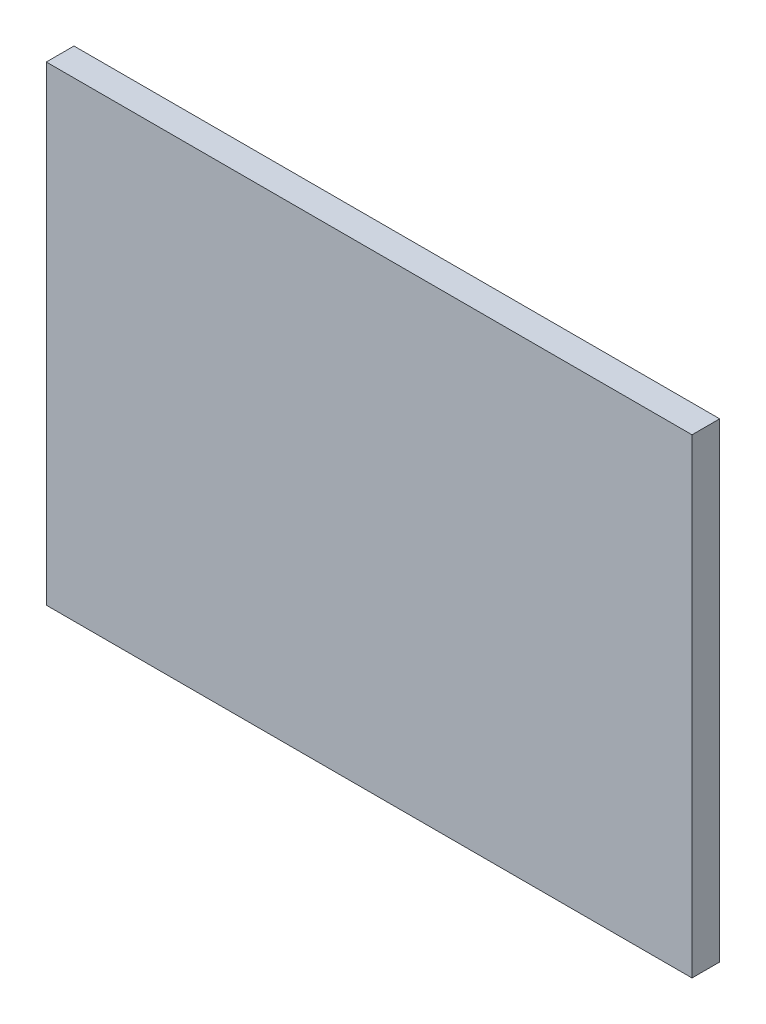
ISO-10303-21;
HEADER;
FILE_DESCRIPTION(('STEP AP214'),'2;1');
FILE_NAME('part.step','',(''),(''),'','','');
FILE_SCHEMA(('AUTOMOTIVE_DESIGN { 1 0 10303 214 1 1 1 1 }'));
ENDSEC;
DATA;
#1=APPLICATION_CONTEXT('core data for automotive mechanical design processes');
#2=APPLICATION_PROTOCOL_DEFINITION('international standard','automotive_design',2000,#1);
#3=PRODUCT_CONTEXT('',#1,'mechanical');
#4=PRODUCT('Part','Part','',(#3));
#5=PRODUCT_RELATED_PRODUCT_CATEGORY('part','',(#4));
#6=PRODUCT_DEFINITION_FORMATION('','',#4);
#7=PRODUCT_DEFINITION_CONTEXT('part definition',#1,'design');
#8=PRODUCT_DEFINITION('design','',#6,#7);
#9=PRODUCT_DEFINITION_SHAPE('','',#8);
#10=(LENGTH_UNIT() NAMED_UNIT(*) SI_UNIT(.MILLI.,.METRE.));
#11=(NAMED_UNIT(*) PLANE_ANGLE_UNIT() SI_UNIT($,.RADIAN.));
#12=(NAMED_UNIT(*) SI_UNIT($,.STERADIAN.) SOLID_ANGLE_UNIT());
#13=UNCERTAINTY_MEASURE_WITH_UNIT(LENGTH_MEASURE(1.E-05),#10,'distance_accuracy_value','');
#14=(GEOMETRIC_REPRESENTATION_CONTEXT(3) GLOBAL_UNCERTAINTY_ASSIGNED_CONTEXT((#13)) GLOBAL_UNIT_ASSIGNED_CONTEXT((#10,
#11,#12)) REPRESENTATION_CONTEXT('',''));
#15=CARTESIAN_POINT('',(0.,0.,0.));
#16=DIRECTION('',(0.,0.,1.));
#17=DIRECTION('',(1.,0.,0.));
#18=AXIS2_PLACEMENT_3D('',#15,#16,#17);
#19=CARTESIAN_POINT('',(35.,25.5,3.));
#20=DIRECTION('',(-1.,0.,0.));
#21=DIRECTION('',(0.,0.,1.));
#22=AXIS2_PLACEMENT_3D('',#19,#20,#21);
#23=PLANE('',#22);
#24=DIRECTION('',(0.,1.,0.));
#25=VECTOR('',#24,1.);
#26=CARTESIAN_POINT('',(35.,25.5,0.));
#27=LINE('',#26,#25);
#28=CARTESIAN_POINT('',(35.,-25.5,0.));
#29=VERTEX_POINT('',#28);
#30=CARTESIAN_POINT('',(35.,25.5,0.));
#31=VERTEX_POINT('',#30);
#32=EDGE_CURVE('E95',#29,#31,#27,.T.);
#33=ORIENTED_EDGE('',*,*,#32,.T.);
#34=DIRECTION('',(0.,0.,-1.));
#35=VECTOR('',#34,1.);
#36=CARTESIAN_POINT('',(35.,25.5,3.));
#37=LINE('',#36,#35);
#38=CARTESIAN_POINT('',(35.,25.5,3.));
#39=VERTEX_POINT('',#38);
#40=EDGE_CURVE('E11',#39,#31,#37,.T.);
#41=ORIENTED_EDGE('',*,*,#40,.F.);
#42=DIRECTION('',(0.,1.,0.));
#43=VECTOR('',#42,1.);
#44=CARTESIAN_POINT('',(35.,25.5,3.));
#45=LINE('',#44,#43);
#46=CARTESIAN_POINT('',(35.,-25.5,3.));
#47=VERTEX_POINT('',#46);
#48=EDGE_CURVE('E83',#47,#39,#45,.T.);
#49=ORIENTED_EDGE('',*,*,#48,.F.);
#50=DIRECTION('',(0.,0.,-1.));
#51=VECTOR('',#50,1.);
#52=CARTESIAN_POINT('',(35.,-25.5,3.));
#53=LINE('',#52,#51);
#54=EDGE_CURVE('E91',#47,#29,#53,.T.);
#55=ORIENTED_EDGE('',*,*,#54,.T.);
#56=EDGE_LOOP('',(#33,#41,#49,#55));
#57=FACE_BOUND('',#56,.T.);
#58=ADVANCED_FACE('F32',(#57),#23,.F.);
#59=CARTESIAN_POINT('',(-35.,25.5,3.));
#60=DIRECTION('',(0.,-1.,0.));
#61=DIRECTION('',(0.,0.,-1.));
#62=AXIS2_PLACEMENT_3D('',#59,#60,#61);
#63=PLANE('',#62);
#64=DIRECTION('',(-1.,0.,0.));
#65=VECTOR('',#64,1.);
#66=CARTESIAN_POINT('',(-35.,25.5,0.));
#67=LINE('',#66,#65);
#68=CARTESIAN_POINT('',(-35.,25.5,0.));
#69=VERTEX_POINT('',#68);
#70=EDGE_CURVE('E87',#31,#69,#67,.T.);
#71=ORIENTED_EDGE('',*,*,#70,.T.);
#72=DIRECTION('',(0.,0.,-1.));
#73=VECTOR('',#72,1.);
#74=CARTESIAN_POINT('',(-35.,25.5,3.));
#75=LINE('',#74,#73);
#76=CARTESIAN_POINT('',(-35.,25.5,3.));
#77=VERTEX_POINT('',#76);
#78=EDGE_CURVE('E40',#77,#69,#75,.T.);
#79=ORIENTED_EDGE('',*,*,#78,.F.);
#80=DIRECTION('',(-1.,0.,0.));
#81=VECTOR('',#80,1.);
#82=CARTESIAN_POINT('',(-35.,25.5,3.));
#83=LINE('',#82,#81);
#84=EDGE_CURVE('E78',#39,#77,#83,.T.);
#85=ORIENTED_EDGE('',*,*,#84,.F.);
#86=ORIENTED_EDGE('',*,*,#40,.T.);
#87=EDGE_LOOP('',(#71,#79,#85,#86));
#88=FACE_BOUND('',#87,.T.);
#89=ADVANCED_FACE('F86',(#88),#63,.F.);
#90=CARTESIAN_POINT('',(-35.,25.5,3.));
#91=DIRECTION('',(1.,0.,0.));
#92=DIRECTION('',(0.,1.,0.));
#93=AXIS2_PLACEMENT_3D('',#90,#91,#92);
#94=PLANE('',#93);
#95=DIRECTION('',(0.,-1.,0.));
#96=VECTOR('',#95,1.);
#97=CARTESIAN_POINT('',(-35.,25.5,0.));
#98=LINE('',#97,#96);
#99=CARTESIAN_POINT('',(-35.,-25.5,0.));
#100=VERTEX_POINT('',#99);
#101=EDGE_CURVE('E65',#69,#100,#98,.T.);
#102=ORIENTED_EDGE('',*,*,#101,.T.);
#103=DIRECTION('',(0.,0.,-1.));
#104=VECTOR('',#103,1.);
#105=CARTESIAN_POINT('',(-35.,-25.5,3.));
#106=LINE('',#105,#104);
#107=CARTESIAN_POINT('',(-35.,-25.5,3.));
#108=VERTEX_POINT('',#107);
#109=EDGE_CURVE('E88',#108,#100,#106,.T.);
#110=ORIENTED_EDGE('',*,*,#109,.F.);
#111=DIRECTION('',(0.,-1.,0.));
#112=VECTOR('',#111,1.);
#113=CARTESIAN_POINT('',(-35.,25.5,3.));
#114=LINE('',#113,#112);
#115=EDGE_CURVE('E81',#77,#108,#114,.T.);
#116=ORIENTED_EDGE('',*,*,#115,.F.);
#117=ORIENTED_EDGE('',*,*,#78,.T.);
#118=EDGE_LOOP('',(#102,#110,#116,#117));
#119=FACE_BOUND('',#118,.T.);
#120=ADVANCED_FACE('F89',(#119),#94,.F.);
#121=CARTESIAN_POINT('',(-35.,-25.5,3.));
#122=DIRECTION('',(0.,1.,0.));
#123=DIRECTION('',(0.,0.,1.));
#124=AXIS2_PLACEMENT_3D('',#121,#122,#123);
#125=PLANE('',#124);
#126=DIRECTION('',(1.,0.,0.));
#127=VECTOR('',#126,1.);
#128=CARTESIAN_POINT('',(-35.,-25.5,0.));
#129=LINE('',#128,#127);
#130=EDGE_CURVE('E71',#100,#29,#129,.T.);
#131=ORIENTED_EDGE('',*,*,#130,.T.);
#132=ORIENTED_EDGE('',*,*,#54,.F.);
#133=DIRECTION('',(1.,0.,0.));
#134=VECTOR('',#133,1.);
#135=CARTESIAN_POINT('',(-35.,-25.5,3.));
#136=LINE('',#135,#134);
#137=EDGE_CURVE('E48',#108,#47,#136,.T.);
#138=ORIENTED_EDGE('',*,*,#137,.F.);
#139=ORIENTED_EDGE('',*,*,#109,.T.);
#140=EDGE_LOOP('',(#131,#132,#138,#139));
#141=FACE_BOUND('',#140,.T.);
#142=ADVANCED_FACE('F102',(#141),#125,.F.);
#143=CARTESIAN_POINT('',(0.,0.,3.));
#144=DIRECTION('',(0.,0.,1.));
#145=DIRECTION('',(1.,0.,0.));
#146=AXIS2_PLACEMENT_3D('',#143,#144,#145);
#147=PLANE('',#146);
#148=ORIENTED_EDGE('',*,*,#48,.T.);
#149=ORIENTED_EDGE('',*,*,#84,.T.);
#150=ORIENTED_EDGE('',*,*,#115,.T.);
#151=ORIENTED_EDGE('',*,*,#137,.T.);
#152=EDGE_LOOP('',(#148,#149,#150,#151));
#153=FACE_BOUND('',#152,.T.);
#154=ADVANCED_FACE('F79',(#153),#147,.T.);
#155=CARTESIAN_POINT('',(0.,0.,0.));
#156=DIRECTION('',(0.,0.,1.));
#157=DIRECTION('',(1.,0.,0.));
#158=AXIS2_PLACEMENT_3D('',#155,#156,#157);
#159=PLANE('',#158);
#160=ORIENTED_EDGE('',*,*,#32,.F.);
#161=ORIENTED_EDGE('',*,*,#130,.F.);
#162=ORIENTED_EDGE('',*,*,#101,.F.);
#163=ORIENTED_EDGE('',*,*,#70,.F.);
#164=EDGE_LOOP('',(#160,#161,#162,#163));
#165=FACE_BOUND('',#164,.T.);
#166=ADVANCED_FACE('F105',(#165),#159,.F.);
#167=CLOSED_SHELL('',(#58,#89,#120,#142,#154,#166));
#168=MANIFOLD_SOLID_BREP('B2',#167);
#169=ADVANCED_BREP_SHAPE_REPRESENTATION('',(#18,#168),#14);
#170=SHAPE_DEFINITION_REPRESENTATION(#9,#169);
ENDSEC;
END-ISO-10303-21;
